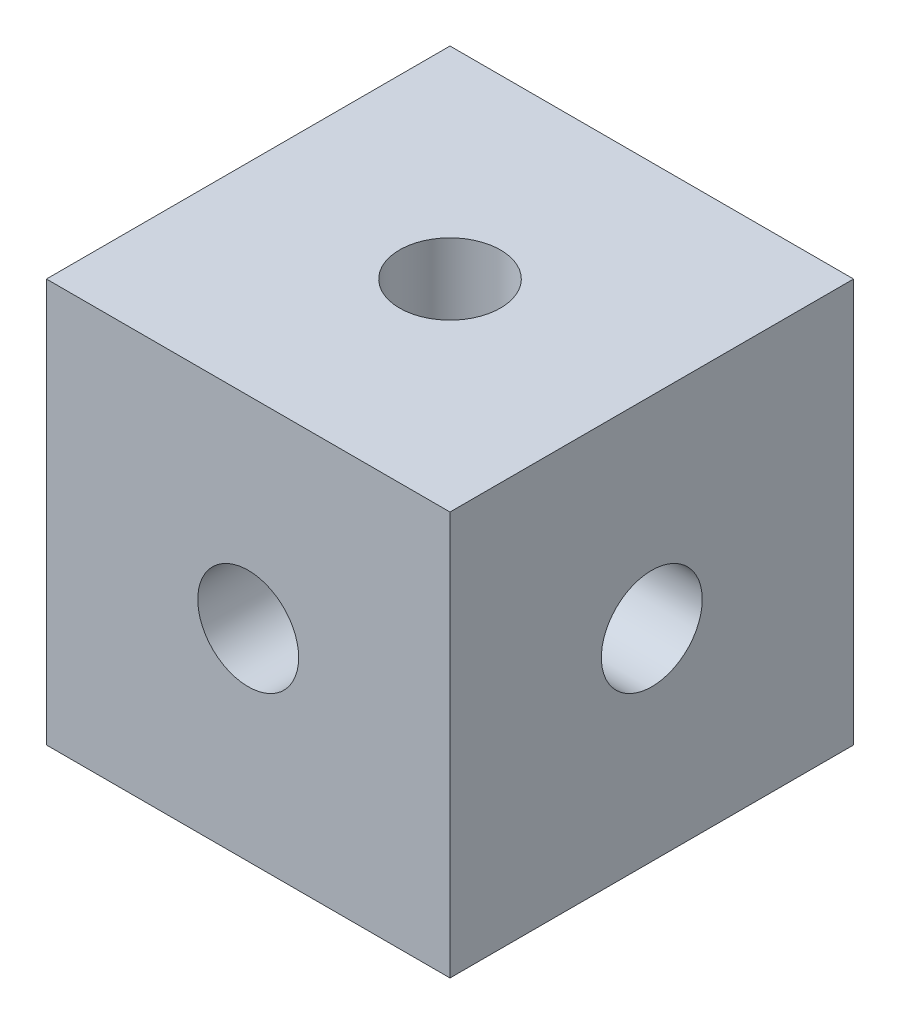
ISO-10303-21;
HEADER;
FILE_DESCRIPTION(('STEP AP214'),'2;1');
FILE_NAME('part.step','',(''),(''),'','','');
FILE_SCHEMA(('AUTOMOTIVE_DESIGN { 1 0 10303 214 1 1 1 1 }'));
ENDSEC;
DATA;
#1=APPLICATION_CONTEXT('core data for automotive mechanical design processes');
#2=APPLICATION_PROTOCOL_DEFINITION('international standard','automotive_design',2000,#1);
#3=PRODUCT_CONTEXT('',#1,'mechanical');
#4=PRODUCT('Part','Part','',(#3));
#5=PRODUCT_RELATED_PRODUCT_CATEGORY('part','',(#4));
#6=PRODUCT_DEFINITION_FORMATION('','',#4);
#7=PRODUCT_DEFINITION_CONTEXT('part definition',#1,'design');
#8=PRODUCT_DEFINITION('design','',#6,#7);
#9=PRODUCT_DEFINITION_SHAPE('','',#8);
#10=(LENGTH_UNIT() NAMED_UNIT(*) SI_UNIT(.MILLI.,.METRE.));
#11=(NAMED_UNIT(*) PLANE_ANGLE_UNIT() SI_UNIT($,.RADIAN.));
#12=(NAMED_UNIT(*) SI_UNIT($,.STERADIAN.) SOLID_ANGLE_UNIT());
#13=UNCERTAINTY_MEASURE_WITH_UNIT(LENGTH_MEASURE(1.E-05),#10,'distance_accuracy_value','');
#14=(GEOMETRIC_REPRESENTATION_CONTEXT(3) GLOBAL_UNCERTAINTY_ASSIGNED_CONTEXT((#13)) GLOBAL_UNIT_ASSIGNED_CONTEXT((#10,
#11,#12)) REPRESENTATION_CONTEXT('',''));
#15=CARTESIAN_POINT('',(0.,0.,0.));
#16=DIRECTION('',(0.,0.,1.));
#17=DIRECTION('',(1.,0.,0.));
#18=AXIS2_PLACEMENT_3D('',#15,#16,#17);
#19=CARTESIAN_POINT('',(0.,5.,0.));
#20=DIRECTION('',(0.,1.,0.));
#21=DIRECTION('',(0.,0.,1.));
#22=AXIS2_PLACEMENT_3D('',#19,#20,#21);
#23=CYLINDRICAL_SURFACE('',#22,1.25);
#24=CARTESIAN_POINT('',(0.,5.,0.));
#25=DIRECTION('',(0.,1.,0.));
#26=DIRECTION('',(0.,0.,1.));
#27=AXIS2_PLACEMENT_3D('',#24,#25,#26);
#28=CIRCLE('',#27,1.25);
#29=CARTESIAN_POINT('',(0.,5.,1.25));
#30=VERTEX_POINT('',#29);
#31=EDGE_CURVE('E164',#30,#30,#28,.T.);
#32=ORIENTED_EDGE('',*,*,#31,.T.);
#33=EDGE_LOOP('',(#32));
#34=FACE_BOUND('',#33,.T.);
#35=CARTESIAN_POINT('',(0.,0.,0.));
#36=DIRECTION('',(0.707106781186547,0.707106781186547,0.));
#37=DIRECTION('',(-0.707106781186547,0.707106781186547,0.));
#38=AXIS2_PLACEMENT_3D('',#35,#36,#37);
#39=ELLIPSE('',#38,1.76776695296637,1.25);
#40=CARTESIAN_POINT('',(-0.883883476483183,0.883883476483183,0.883883476483183));
#41=VERTEX_POINT('',#40);
#42=CARTESIAN_POINT('',(-0.883883476483183,0.883883476483183,-0.883883476483183));
#43=VERTEX_POINT('',#42);
#44=EDGE_CURVE('E112',#41,#43,#39,.F.);
#45=ORIENTED_EDGE('',*,*,#44,.T.);
#46=CARTESIAN_POINT('',(0.,0.,0.));
#47=DIRECTION('',(0.,0.707106781186547,0.707106781186547));
#48=DIRECTION('',(0.,0.707106781186547,-0.707106781186547));
#49=AXIS2_PLACEMENT_3D('',#46,#47,#48);
#50=ELLIPSE('',#49,1.76776695296637,1.25);
#51=CARTESIAN_POINT('',(0.883883476483183,0.883883476483183,-0.883883476483183));
#52=VERTEX_POINT('',#51);
#53=EDGE_CURVE('E120',#43,#52,#50,.F.);
#54=ORIENTED_EDGE('',*,*,#53,.T.);
#55=CARTESIAN_POINT('',(0.,0.,0.));
#56=DIRECTION('',(-0.707106781186547,0.707106781186547,0.));
#57=DIRECTION('',(0.707106781186547,0.707106781186547,0.));
#58=AXIS2_PLACEMENT_3D('',#55,#56,#57);
#59=ELLIPSE('',#58,1.76776695296637,1.25);
#60=CARTESIAN_POINT('',(0.883883476483183,0.883883476483183,0.883883476483183));
#61=VERTEX_POINT('',#60);
#62=EDGE_CURVE('E119',#52,#61,#59,.F.);
#63=ORIENTED_EDGE('',*,*,#62,.T.);
#64=CARTESIAN_POINT('',(0.,0.,0.));
#65=DIRECTION('',(0.,0.707106781186547,-0.707106781186547));
#66=DIRECTION('',(0.,0.707106781186547,0.707106781186547));
#67=AXIS2_PLACEMENT_3D('',#64,#65,#66);
#68=ELLIPSE('',#67,1.76776695296637,1.25);
#69=EDGE_CURVE('E176',#61,#41,#68,.F.);
#70=ORIENTED_EDGE('',*,*,#69,.T.);
#71=EDGE_LOOP('',(#45,#54,#63,#70));
#72=FACE_BOUND('',#71,.T.);
#73=ADVANCED_FACE('F43',(#34,#72),#23,.F.);
#74=CARTESIAN_POINT('',(5.,5.,-5.));
#75=DIRECTION('',(-1.,0.,0.));
#76=DIRECTION('',(0.,0.,1.));
#77=AXIS2_PLACEMENT_3D('',#74,#75,#76);
#78=PLANE('',#77);
#79=CARTESIAN_POINT('',(5.,0.,0.));
#80=DIRECTION('',(1.,0.,0.));
#81=DIRECTION('',(0.,0.,-1.));
#82=AXIS2_PLACEMENT_3D('',#79,#80,#81);
#83=CIRCLE('',#82,1.25);
#84=CARTESIAN_POINT('',(5.,0.,-1.25));
#85=VERTEX_POINT('',#84);
#86=EDGE_CURVE('E170',#85,#85,#83,.T.);
#87=ORIENTED_EDGE('',*,*,#86,.F.);
#88=EDGE_LOOP('',(#87));
#89=FACE_BOUND('',#88,.T.);
#90=DIRECTION('',(0.,0.,-1.));
#91=VECTOR('',#90,1.);
#92=CARTESIAN_POINT('',(5.,-5.,-5.));
#93=LINE('',#92,#91);
#94=CARTESIAN_POINT('',(5.,-5.,5.));
#95=VERTEX_POINT('',#94);
#96=CARTESIAN_POINT('',(5.,-5.,-5.));
#97=VERTEX_POINT('',#96);
#98=EDGE_CURVE('E151',#95,#97,#93,.T.);
#99=ORIENTED_EDGE('',*,*,#98,.T.);
#100=DIRECTION('',(0.,-1.,0.));
#101=VECTOR('',#100,1.);
#102=CARTESIAN_POINT('',(5.,5.,-5.));
#103=LINE('',#102,#101);
#104=CARTESIAN_POINT('',(5.,5.,-5.));
#105=VERTEX_POINT('',#104);
#106=EDGE_CURVE('E131',#105,#97,#103,.T.);
#107=ORIENTED_EDGE('',*,*,#106,.F.);
#108=DIRECTION('',(0.,0.,-1.));
#109=VECTOR('',#108,1.);
#110=CARTESIAN_POINT('',(5.,5.,-5.));
#111=LINE('',#110,#109);
#112=CARTESIAN_POINT('',(5.,5.,5.));
#113=VERTEX_POINT('',#112);
#114=EDGE_CURVE('E146',#113,#105,#111,.T.);
#115=ORIENTED_EDGE('',*,*,#114,.F.);
#116=DIRECTION('',(0.,-1.,0.));
#117=VECTOR('',#116,1.);
#118=CARTESIAN_POINT('',(5.,5.,5.));
#119=LINE('',#118,#117);
#120=EDGE_CURVE('E140',#113,#95,#119,.T.);
#121=ORIENTED_EDGE('',*,*,#120,.T.);
#122=EDGE_LOOP('',(#99,#107,#115,#121));
#123=FACE_BOUND('',#122,.T.);
#124=ADVANCED_FACE('F45',(#89,#123),#78,.F.);
#125=CARTESIAN_POINT('',(-5.,5.,-5.));
#126=DIRECTION('',(0.,0.,1.));
#127=DIRECTION('',(1.,0.,0.));
#128=AXIS2_PLACEMENT_3D('',#125,#126,#127);
#129=PLANE('',#128);
#130=CARTESIAN_POINT('',(0.,0.,-5.));
#131=DIRECTION('',(0.,0.,1.));
#132=DIRECTION('',(1.,0.,0.));
#133=AXIS2_PLACEMENT_3D('',#130,#131,#132);
#134=CIRCLE('',#133,1.25);
#135=CARTESIAN_POINT('',(1.25,0.,-5.));
#136=VERTEX_POINT('',#135);
#137=EDGE_CURVE('E182',#136,#136,#134,.T.);
#138=ORIENTED_EDGE('',*,*,#137,.T.);
#139=EDGE_LOOP('',(#138));
#140=FACE_BOUND('',#139,.T.);
#141=DIRECTION('',(-1.,0.,0.));
#142=VECTOR('',#141,1.);
#143=CARTESIAN_POINT('',(-5.,-5.,-5.));
#144=LINE('',#143,#142);
#145=CARTESIAN_POINT('',(-5.,-5.,-5.));
#146=VERTEX_POINT('',#145);
#147=EDGE_CURVE('E149',#97,#146,#144,.T.);
#148=ORIENTED_EDGE('',*,*,#147,.T.);
#149=DIRECTION('',(0.,-1.,0.));
#150=VECTOR('',#149,1.);
#151=CARTESIAN_POINT('',(-5.,5.,-5.));
#152=LINE('',#151,#150);
#153=CARTESIAN_POINT('',(-5.,5.,-5.));
#154=VERTEX_POINT('',#153);
#155=EDGE_CURVE('E134',#154,#146,#152,.T.);
#156=ORIENTED_EDGE('',*,*,#155,.F.);
#157=DIRECTION('',(-1.,0.,0.));
#158=VECTOR('',#157,1.);
#159=CARTESIAN_POINT('',(-5.,5.,-5.));
#160=LINE('',#159,#158);
#161=EDGE_CURVE('E158',#105,#154,#160,.T.);
#162=ORIENTED_EDGE('',*,*,#161,.F.);
#163=ORIENTED_EDGE('',*,*,#106,.T.);
#164=EDGE_LOOP('',(#148,#156,#162,#163));
#165=FACE_BOUND('',#164,.T.);
#166=ADVANCED_FACE('F210',(#140,#165),#129,.F.);
#167=CARTESIAN_POINT('',(-5.,5.,-5.));
#168=DIRECTION('',(1.,0.,0.));
#169=DIRECTION('',(0.,0.,-1.));
#170=AXIS2_PLACEMENT_3D('',#167,#168,#169);
#171=PLANE('',#170);
#172=CARTESIAN_POINT('',(-5.,0.,0.));
#173=DIRECTION('',(1.,0.,0.));
#174=DIRECTION('',(0.,0.,-1.));
#175=AXIS2_PLACEMENT_3D('',#172,#173,#174);
#176=CIRCLE('',#175,1.25);
#177=CARTESIAN_POINT('',(-5.,0.,-1.25));
#178=VERTEX_POINT('',#177);
#179=EDGE_CURVE('E167',#178,#178,#176,.T.);
#180=ORIENTED_EDGE('',*,*,#179,.T.);
#181=EDGE_LOOP('',(#180));
#182=FACE_BOUND('',#181,.T.);
#183=DIRECTION('',(0.,0.,1.));
#184=VECTOR('',#183,1.);
#185=CARTESIAN_POINT('',(-5.,-5.,-5.));
#186=LINE('',#185,#184);
#187=CARTESIAN_POINT('',(-5.,-5.,5.));
#188=VERTEX_POINT('',#187);
#189=EDGE_CURVE('E147',#146,#188,#186,.T.);
#190=ORIENTED_EDGE('',*,*,#189,.T.);
#191=DIRECTION('',(0.,-1.,0.));
#192=VECTOR('',#191,1.);
#193=CARTESIAN_POINT('',(-5.,5.,5.));
#194=LINE('',#193,#192);
#195=CARTESIAN_POINT('',(-5.,5.,5.));
#196=VERTEX_POINT('',#195);
#197=EDGE_CURVE('E137',#196,#188,#194,.T.);
#198=ORIENTED_EDGE('',*,*,#197,.F.);
#199=DIRECTION('',(0.,0.,1.));
#200=VECTOR('',#199,1.);
#201=CARTESIAN_POINT('',(-5.,5.,-5.));
#202=LINE('',#201,#200);
#203=EDGE_CURVE('E156',#154,#196,#202,.T.);
#204=ORIENTED_EDGE('',*,*,#203,.F.);
#205=ORIENTED_EDGE('',*,*,#155,.T.);
#206=EDGE_LOOP('',(#190,#198,#204,#205));
#207=FACE_BOUND('',#206,.T.);
#208=ADVANCED_FACE('F195',(#182,#207),#171,.F.);
#209=CARTESIAN_POINT('',(-5.,5.,5.));
#210=DIRECTION('',(0.,0.,-1.));
#211=DIRECTION('',(-1.,0.,0.));
#212=AXIS2_PLACEMENT_3D('',#209,#210,#211);
#213=PLANE('',#212);
#214=CARTESIAN_POINT('',(0.,0.,5.));
#215=DIRECTION('',(0.,0.,1.));
#216=DIRECTION('',(1.,0.,0.));
#217=AXIS2_PLACEMENT_3D('',#214,#215,#216);
#218=CIRCLE('',#217,1.25);
#219=CARTESIAN_POINT('',(1.25,0.,5.));
#220=VERTEX_POINT('',#219);
#221=EDGE_CURVE('E185',#220,#220,#218,.T.);
#222=ORIENTED_EDGE('',*,*,#221,.F.);
#223=EDGE_LOOP('',(#222));
#224=FACE_BOUND('',#223,.T.);
#225=DIRECTION('',(1.,0.,0.));
#226=VECTOR('',#225,1.);
#227=CARTESIAN_POINT('',(-5.,-5.,5.));
#228=LINE('',#227,#226);
#229=EDGE_CURVE('E144',#188,#95,#228,.T.);
#230=ORIENTED_EDGE('',*,*,#229,.T.);
#231=ORIENTED_EDGE('',*,*,#120,.F.);
#232=DIRECTION('',(1.,0.,0.));
#233=VECTOR('',#232,1.);
#234=CARTESIAN_POINT('',(-5.,5.,5.));
#235=LINE('',#234,#233);
#236=EDGE_CURVE('E143',#196,#113,#235,.T.);
#237=ORIENTED_EDGE('',*,*,#236,.F.);
#238=ORIENTED_EDGE('',*,*,#197,.T.);
#239=EDGE_LOOP('',(#230,#231,#237,#238));
#240=FACE_BOUND('',#239,.T.);
#241=ADVANCED_FACE('F191',(#224,#240),#213,.F.);
#242=CARTESIAN_POINT('',(0.,5.,0.));
#243=DIRECTION('',(0.,1.,0.));
#244=DIRECTION('',(0.,0.,1.));
#245=AXIS2_PLACEMENT_3D('',#242,#243,#244);
#246=PLANE('',#245);
#247=ORIENTED_EDGE('',*,*,#31,.F.);
#248=EDGE_LOOP('',(#247));
#249=FACE_BOUND('',#248,.T.);
#250=ORIENTED_EDGE('',*,*,#114,.T.);
#251=ORIENTED_EDGE('',*,*,#161,.T.);
#252=ORIENTED_EDGE('',*,*,#203,.T.);
#253=ORIENTED_EDGE('',*,*,#236,.T.);
#254=EDGE_LOOP('',(#250,#251,#252,#253));
#255=FACE_BOUND('',#254,.T.);
#256=ADVANCED_FACE('F194',(#249,#255),#246,.T.);
#257=CARTESIAN_POINT('',(0.,-5.,0.));
#258=DIRECTION('',(0.,1.,0.));
#259=DIRECTION('',(0.,0.,1.));
#260=AXIS2_PLACEMENT_3D('',#257,#258,#259);
#261=PLANE('',#260);
#262=CARTESIAN_POINT('',(0.,-5.,0.));
#263=DIRECTION('',(0.,1.,0.));
#264=DIRECTION('',(0.,0.,1.));
#265=AXIS2_PLACEMENT_3D('',#262,#263,#264);
#266=CIRCLE('',#265,1.25);
#267=CARTESIAN_POINT('',(0.,-5.,1.25));
#268=VERTEX_POINT('',#267);
#269=EDGE_CURVE('E154',#268,#268,#266,.T.);
#270=ORIENTED_EDGE('',*,*,#269,.T.);
#271=EDGE_LOOP('',(#270));
#272=FACE_BOUND('',#271,.T.);
#273=ORIENTED_EDGE('',*,*,#98,.F.);
#274=ORIENTED_EDGE('',*,*,#229,.F.);
#275=ORIENTED_EDGE('',*,*,#189,.F.);
#276=ORIENTED_EDGE('',*,*,#147,.F.);
#277=EDGE_LOOP('',(#273,#274,#275,#276));
#278=FACE_BOUND('',#277,.T.);
#279=ADVANCED_FACE('F207',(#272,#278),#261,.F.);
#280=CARTESIAN_POINT('',(0.,0.,0.));
#281=DIRECTION('',(-0.707106781186547,0.707106781186547,0.));
#282=DIRECTION('',(0.707106781186547,0.707106781186547,0.));
#283=AXIS2_PLACEMENT_3D('',#280,#281,#282);
#284=ELLIPSE('',#283,1.76776695296637,1.25);
#285=CARTESIAN_POINT('',(-0.883883476483183,-0.883883476483183,-0.883883476483183));
#286=VERTEX_POINT('',#285);
#287=CARTESIAN_POINT('',(-0.883883476483183,-0.883883476483183,0.883883476483183));
#288=VERTEX_POINT('',#287);
#289=EDGE_CURVE('E124',#286,#288,#284,.T.);
#290=ORIENTED_EDGE('',*,*,#289,.T.);
#291=CARTESIAN_POINT('',(0.,0.,0.));
#292=DIRECTION('',(0.,0.707106781186547,0.707106781186547));
#293=DIRECTION('',(0.,0.707106781186547,-0.707106781186547));
#294=AXIS2_PLACEMENT_3D('',#291,#292,#293);
#295=ELLIPSE('',#294,1.76776695296637,1.25);
#296=CARTESIAN_POINT('',(0.883883476483183,-0.883883476483183,0.883883476483183));
#297=VERTEX_POINT('',#296);
#298=EDGE_CURVE('E11',#288,#297,#295,.T.);
#299=ORIENTED_EDGE('',*,*,#298,.T.);
#300=CARTESIAN_POINT('',(0.,0.,0.));
#301=DIRECTION('',(0.707106781186547,0.707106781186547,0.));
#302=DIRECTION('',(-0.707106781186547,0.707106781186547,0.));
#303=AXIS2_PLACEMENT_3D('',#300,#301,#302);
#304=ELLIPSE('',#303,1.76776695296637,1.25);
#305=CARTESIAN_POINT('',(0.883883476483183,-0.883883476483183,-0.883883476483183));
#306=VERTEX_POINT('',#305);
#307=EDGE_CURVE('E117',#297,#306,#304,.T.);
#308=ORIENTED_EDGE('',*,*,#307,.T.);
#309=CARTESIAN_POINT('',(0.,0.,0.));
#310=DIRECTION('',(0.,0.707106781186547,-0.707106781186547));
#311=DIRECTION('',(0.,0.707106781186547,0.707106781186547));
#312=AXIS2_PLACEMENT_3D('',#309,#310,#311);
#313=ELLIPSE('',#312,1.76776695296637,1.25);
#314=EDGE_CURVE('E51',#306,#286,#313,.T.);
#315=ORIENTED_EDGE('',*,*,#314,.T.);
#316=EDGE_LOOP('',(#290,#299,#308,#315));
#317=FACE_BOUND('',#316,.T.);
#318=ORIENTED_EDGE('',*,*,#269,.F.);
#319=EDGE_LOOP('',(#318));
#320=FACE_BOUND('',#319,.T.);
#321=ADVANCED_FACE('F122',(#317,#320),#23,.F.);
#322=CARTESIAN_POINT('',(5.,0.,0.));
#323=DIRECTION('',(1.,0.,0.));
#324=DIRECTION('',(0.,0.,-1.));
#325=AXIS2_PLACEMENT_3D('',#322,#323,#324);
#326=CYLINDRICAL_SURFACE('',#325,1.25);
#327=ORIENTED_EDGE('',*,*,#86,.T.);
#328=EDGE_LOOP('',(#327));
#329=FACE_BOUND('',#328,.T.);
#330=ORIENTED_EDGE('',*,*,#62,.F.);
#331=CARTESIAN_POINT('',(0.,0.,0.));
#332=DIRECTION('',(0.707106781186548,0.,0.707106781186547));
#333=DIRECTION('',(0.707106781186547,0.,-0.707106781186547));
#334=AXIS2_PLACEMENT_3D('',#331,#332,#333);
#335=ELLIPSE('',#334,1.76776695296637,1.25);
#336=EDGE_CURVE('E106',#52,#306,#335,.F.);
#337=ORIENTED_EDGE('',*,*,#336,.T.);
#338=ORIENTED_EDGE('',*,*,#307,.F.);
#339=CARTESIAN_POINT('',(0.,0.,0.));
#340=DIRECTION('',(0.707106781186547,0.,-0.707106781186547));
#341=DIRECTION('',(0.707106781186548,0.,0.707106781186547));
#342=AXIS2_PLACEMENT_3D('',#339,#340,#341);
#343=ELLIPSE('',#342,1.76776695296637,1.25);
#344=EDGE_CURVE('E58',#297,#61,#343,.F.);
#345=ORIENTED_EDGE('',*,*,#344,.T.);
#346=EDGE_LOOP('',(#330,#337,#338,#345));
#347=FACE_BOUND('',#346,.T.);
#348=ADVANCED_FACE('F116',(#329,#347),#326,.F.);
#349=ORIENTED_EDGE('',*,*,#179,.F.);
#350=EDGE_LOOP('',(#349));
#351=FACE_BOUND('',#350,.T.);
#352=ORIENTED_EDGE('',*,*,#44,.F.);
#353=CARTESIAN_POINT('',(0.,0.,0.));
#354=DIRECTION('',(0.707106781186548,0.,0.707106781186547));
#355=DIRECTION('',(0.707106781186547,0.,-0.707106781186547));
#356=AXIS2_PLACEMENT_3D('',#353,#354,#355);
#357=ELLIPSE('',#356,1.76776695296637,1.25);
#358=EDGE_CURVE('E173',#41,#288,#357,.T.);
#359=ORIENTED_EDGE('',*,*,#358,.T.);
#360=ORIENTED_EDGE('',*,*,#289,.F.);
#361=CARTESIAN_POINT('',(0.,0.,0.));
#362=DIRECTION('',(0.707106781186547,0.,-0.707106781186547));
#363=DIRECTION('',(0.707106781186548,0.,0.707106781186547));
#364=AXIS2_PLACEMENT_3D('',#361,#362,#363);
#365=ELLIPSE('',#364,1.76776695296637,1.25);
#366=EDGE_CURVE('E65',#286,#43,#365,.T.);
#367=ORIENTED_EDGE('',*,*,#366,.T.);
#368=EDGE_LOOP('',(#352,#359,#360,#367));
#369=FACE_BOUND('',#368,.T.);
#370=ADVANCED_FACE('F236',(#351,#369),#326,.F.);
#371=CARTESIAN_POINT('',(0.,0.,5.));
#372=DIRECTION('',(0.,0.,1.));
#373=DIRECTION('',(1.,0.,0.));
#374=AXIS2_PLACEMENT_3D('',#371,#372,#373);
#375=CYLINDRICAL_SURFACE('',#374,1.25);
#376=ORIENTED_EDGE('',*,*,#137,.F.);
#377=EDGE_LOOP('',(#376));
#378=FACE_BOUND('',#377,.T.);
#379=ORIENTED_EDGE('',*,*,#53,.F.);
#380=ORIENTED_EDGE('',*,*,#366,.F.);
#381=ORIENTED_EDGE('',*,*,#314,.F.);
#382=ORIENTED_EDGE('',*,*,#336,.F.);
#383=EDGE_LOOP('',(#379,#380,#381,#382));
#384=FACE_BOUND('',#383,.T.);
#385=ADVANCED_FACE('F105',(#378,#384),#375,.F.);
#386=ORIENTED_EDGE('',*,*,#221,.T.);
#387=EDGE_LOOP('',(#386));
#388=FACE_BOUND('',#387,.T.);
#389=ORIENTED_EDGE('',*,*,#69,.F.);
#390=ORIENTED_EDGE('',*,*,#344,.F.);
#391=ORIENTED_EDGE('',*,*,#298,.F.);
#392=ORIENTED_EDGE('',*,*,#358,.F.);
#393=EDGE_LOOP('',(#389,#390,#391,#392));
#394=FACE_BOUND('',#393,.T.);
#395=ADVANCED_FACE('F189',(#388,#394),#375,.F.);
#396=CLOSED_SHELL('',(#73,#124,#166,#208,#241,#256,#279,#321,#348,#370,#385,#395));
#397=MANIFOLD_SOLID_BREP('B2',#396);
#398=ADVANCED_BREP_SHAPE_REPRESENTATION('',(#18,#397),#14);
#399=SHAPE_DEFINITION_REPRESENTATION(#9,#398);
ENDSEC;
END-ISO-10303-21;
